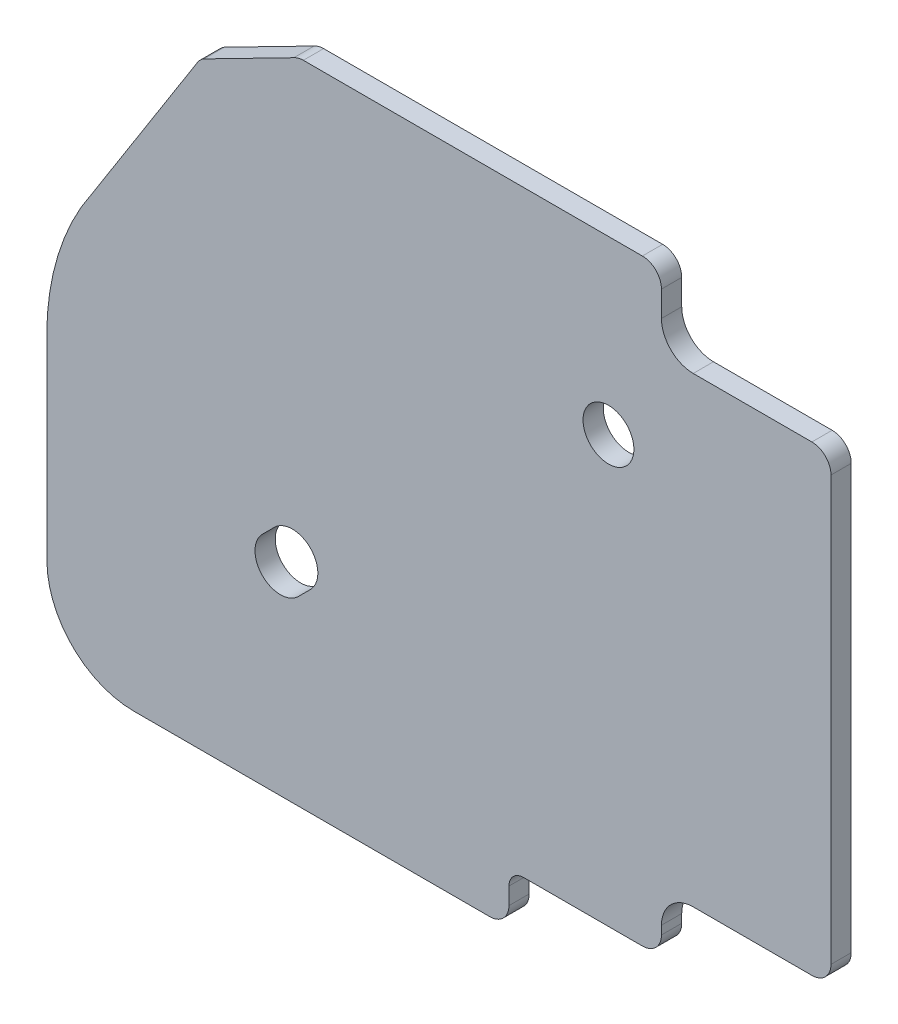
ISO-10303-21;
HEADER;
FILE_DESCRIPTION(('STEP AP214'),'2;1');
FILE_NAME('part.step','',(''),(''),'','','');
FILE_SCHEMA(('AUTOMOTIVE_DESIGN { 1 0 10303 214 1 1 1 1 }'));
ENDSEC;
DATA;
#1=APPLICATION_CONTEXT('core data for automotive mechanical design processes');
#2=APPLICATION_PROTOCOL_DEFINITION('international standard','automotive_design',2000,#1);
#3=PRODUCT_CONTEXT('',#1,'mechanical');
#4=PRODUCT('Part','Part','',(#3));
#5=PRODUCT_RELATED_PRODUCT_CATEGORY('part','',(#4));
#6=PRODUCT_DEFINITION_FORMATION('','',#4);
#7=PRODUCT_DEFINITION_CONTEXT('part definition',#1,'design');
#8=PRODUCT_DEFINITION('design','',#6,#7);
#9=PRODUCT_DEFINITION_SHAPE('','',#8);
#10=(LENGTH_UNIT() NAMED_UNIT(*) SI_UNIT(.MILLI.,.METRE.));
#11=(NAMED_UNIT(*) PLANE_ANGLE_UNIT() SI_UNIT($,.RADIAN.));
#12=(NAMED_UNIT(*) SI_UNIT($,.STERADIAN.) SOLID_ANGLE_UNIT());
#13=UNCERTAINTY_MEASURE_WITH_UNIT(LENGTH_MEASURE(1.E-05),#10,'distance_accuracy_value','');
#14=(GEOMETRIC_REPRESENTATION_CONTEXT(3) GLOBAL_UNCERTAINTY_ASSIGNED_CONTEXT((#13)) GLOBAL_UNIT_ASSIGNED_CONTEXT((#10,
#11,#12)) REPRESENTATION_CONTEXT('',''));
#15=CARTESIAN_POINT('',(0.,0.,0.));
#16=DIRECTION('',(0.,0.,1.));
#17=DIRECTION('',(1.,0.,0.));
#18=AXIS2_PLACEMENT_3D('',#15,#16,#17);
#19=CARTESIAN_POINT('',(4.999,-0.127,0.));
#20=DIRECTION('',(0.,1.,0.));
#21=DIRECTION('',(1.,0.,0.));
#22=AXIS2_PLACEMENT_3D('',#19,#20,#21);
#23=PLANE('',#22);
#24=DIRECTION('',(1.,0.,0.));
#25=VECTOR('',#24,1.);
#26=CARTESIAN_POINT('',(4.999,-0.127,1.19540274));
#27=LINE('',#26,#25);
#28=CARTESIAN_POINT('',(4.999,-0.127,1.19540274));
#29=VERTEX_POINT('',#28);
#30=CARTESIAN_POINT('',(26.,-0.127,1.19540274));
#31=VERTEX_POINT('',#30);
#32=EDGE_CURVE('E11',#29,#31,#27,.T.);
#33=ORIENTED_EDGE('',*,*,#32,.F.);
#34=DIRECTION('',(0.,0.,1.));
#35=VECTOR('',#34,1.);
#36=CARTESIAN_POINT('',(4.999,-0.127,0.));
#37=LINE('',#36,#35);
#38=CARTESIAN_POINT('',(4.999,-0.127,0.));
#39=VERTEX_POINT('',#38);
#40=EDGE_CURVE('E24',#39,#29,#37,.T.);
#41=ORIENTED_EDGE('',*,*,#40,.F.);
#42=DIRECTION('',(1.,0.,0.));
#43=VECTOR('',#42,1.);
#44=CARTESIAN_POINT('',(4.999,-0.127,0.));
#45=LINE('',#44,#43);
#46=CARTESIAN_POINT('',(26.,-0.127,0.));
#47=VERTEX_POINT('',#46);
#48=EDGE_CURVE('E446',#39,#47,#45,.T.);
#49=ORIENTED_EDGE('',*,*,#48,.T.);
#50=DIRECTION('',(0.,0.,1.));
#51=VECTOR('',#50,1.);
#52=CARTESIAN_POINT('',(26.,-0.127,0.));
#53=LINE('',#52,#51);
#54=EDGE_CURVE('E37',#47,#31,#53,.T.);
#55=ORIENTED_EDGE('',*,*,#54,.T.);
#56=EDGE_LOOP('',(#33,#41,#49,#55));
#57=FACE_BOUND('',#56,.T.);
#58=ADVANCED_FACE('F17',(#57),#23,.F.);
#59=CARTESIAN_POINT('',(26.000309421842,0.999690578158457,0.));
#60=DIRECTION('',(0.,0.,-1.));
#61=DIRECTION('',(-0.000274628931733841,-0.999999962289474,0.));
#62=AXIS2_PLACEMENT_3D('',#59,#60,#61);
#63=CYLINDRICAL_SURFACE('',#62,1.126690620647);
#64=CARTESIAN_POINT('',(26.000309421842,0.999690578158457,1.19540274));
#65=DIRECTION('',(0.,0.,1.));
#66=DIRECTION('',(-0.000274628931733841,-0.999999962289474,0.));
#67=AXIS2_PLACEMENT_3D('',#64,#65,#66);
#68=CIRCLE('',#67,1.126690620647);
#69=CARTESIAN_POINT('',(27.127,1.,1.19540274));
#70=VERTEX_POINT('',#69);
#71=EDGE_CURVE('E442',#31,#70,#68,.T.);
#72=ORIENTED_EDGE('',*,*,#71,.F.);
#73=ORIENTED_EDGE('',*,*,#54,.F.);
#74=CARTESIAN_POINT('',(26.000309421842,0.999690578158457,0.));
#75=DIRECTION('',(0.,0.,1.));
#76=DIRECTION('',(-0.000274628931733841,-0.999999962289474,0.));
#77=AXIS2_PLACEMENT_3D('',#74,#75,#76);
#78=CIRCLE('',#77,1.126690620647);
#79=CARTESIAN_POINT('',(27.127,1.,0.));
#80=VERTEX_POINT('',#79);
#81=EDGE_CURVE('E439',#47,#80,#78,.T.);
#82=ORIENTED_EDGE('',*,*,#81,.T.);
#83=DIRECTION('',(0.,0.,1.));
#84=VECTOR('',#83,1.);
#85=CARTESIAN_POINT('',(27.127,1.,0.));
#86=LINE('',#85,#84);
#87=EDGE_CURVE('E437',#80,#70,#86,.T.);
#88=ORIENTED_EDGE('',*,*,#87,.T.);
#89=EDGE_LOOP('',(#72,#73,#82,#88));
#90=FACE_BOUND('',#89,.T.);
#91=ADVANCED_FACE('F456',(#90),#63,.T.);
#92=CARTESIAN_POINT('',(27.127,1.,0.));
#93=DIRECTION('',(-1.,0.,0.));
#94=DIRECTION('',(0.,1.,0.));
#95=AXIS2_PLACEMENT_3D('',#92,#93,#94);
#96=PLANE('',#95);
#97=DIRECTION('',(0.,1.,0.));
#98=VECTOR('',#97,1.);
#99=CARTESIAN_POINT('',(27.127,1.,1.19540274));
#100=LINE('',#99,#98);
#101=CARTESIAN_POINT('',(27.127,2.,1.19540274));
#102=VERTEX_POINT('',#101);
#103=EDGE_CURVE('E434',#70,#102,#100,.T.);
#104=ORIENTED_EDGE('',*,*,#103,.F.);
#105=ORIENTED_EDGE('',*,*,#87,.F.);
#106=DIRECTION('',(0.,1.,0.));
#107=VECTOR('',#106,1.);
#108=CARTESIAN_POINT('',(27.127,1.,0.));
#109=LINE('',#108,#107);
#110=CARTESIAN_POINT('',(27.127,2.,0.));
#111=VERTEX_POINT('',#110);
#112=EDGE_CURVE('E431',#80,#111,#109,.T.);
#113=ORIENTED_EDGE('',*,*,#112,.T.);
#114=DIRECTION('',(0.,0.,1.));
#115=VECTOR('',#114,1.);
#116=CARTESIAN_POINT('',(27.127,2.,0.));
#117=LINE('',#116,#115);
#118=EDGE_CURVE('E429',#111,#102,#117,.T.);
#119=ORIENTED_EDGE('',*,*,#118,.T.);
#120=EDGE_LOOP('',(#104,#105,#113,#119));
#121=FACE_BOUND('',#120,.T.);
#122=ADVANCED_FACE('F463',(#121),#96,.F.);
#123=CARTESIAN_POINT('',(28.001040166205,1.998959833795,0.));
#124=DIRECTION('',(0.,0.,-1.));
#125=DIRECTION('',(-0.999999291871229,0.00119006598167,0.));
#126=AXIS2_PLACEMENT_3D('',#123,#124,#125);
#127=CYLINDRICAL_SURFACE('',#126,0.874040785138412);
#128=CARTESIAN_POINT('',(28.001040166205,1.998959833795,1.19540274));
#129=DIRECTION('',(0.,0.,-1.));
#130=DIRECTION('',(-0.999999291871229,0.00119006598167,0.));
#131=AXIS2_PLACEMENT_3D('',#128,#129,#130);
#132=CIRCLE('',#131,0.874040785138412);
#133=CARTESIAN_POINT('',(28.,2.873,1.19540274));
#134=VERTEX_POINT('',#133);
#135=EDGE_CURVE('E426',#102,#134,#132,.T.);
#136=ORIENTED_EDGE('',*,*,#135,.F.);
#137=ORIENTED_EDGE('',*,*,#118,.F.);
#138=CARTESIAN_POINT('',(28.001040166205,1.998959833795,0.));
#139=DIRECTION('',(0.,0.,-1.));
#140=DIRECTION('',(-0.999999291871229,0.00119006598167,0.));
#141=AXIS2_PLACEMENT_3D('',#138,#139,#140);
#142=CIRCLE('',#141,0.874040785138412);
#143=CARTESIAN_POINT('',(28.,2.873,0.));
#144=VERTEX_POINT('',#143);
#145=EDGE_CURVE('E423',#111,#144,#142,.T.);
#146=ORIENTED_EDGE('',*,*,#145,.T.);
#147=DIRECTION('',(0.,0.,1.));
#148=VECTOR('',#147,1.);
#149=CARTESIAN_POINT('',(28.,2.873,0.));
#150=LINE('',#149,#148);
#151=EDGE_CURVE('E421',#144,#134,#150,.T.);
#152=ORIENTED_EDGE('',*,*,#151,.T.);
#153=EDGE_LOOP('',(#136,#137,#146,#152));
#154=FACE_BOUND('',#153,.T.);
#155=ADVANCED_FACE('F465',(#154),#127,.F.);
#156=CARTESIAN_POINT('',(28.,2.873,0.));
#157=DIRECTION('',(0.,1.,0.));
#158=DIRECTION('',(1.,0.,0.));
#159=AXIS2_PLACEMENT_3D('',#156,#157,#158);
#160=PLANE('',#159);
#161=DIRECTION('',(1.,0.,0.));
#162=VECTOR('',#161,1.);
#163=CARTESIAN_POINT('',(28.,2.873,1.19540274));
#164=LINE('',#163,#162);
#165=CARTESIAN_POINT('',(35.,2.873,1.19540274));
#166=VERTEX_POINT('',#165);
#167=EDGE_CURVE('E418',#134,#166,#164,.T.);
#168=ORIENTED_EDGE('',*,*,#167,.F.);
#169=ORIENTED_EDGE('',*,*,#151,.F.);
#170=DIRECTION('',(1.,0.,0.));
#171=VECTOR('',#170,1.);
#172=CARTESIAN_POINT('',(28.,2.873,0.));
#173=LINE('',#172,#171);
#174=CARTESIAN_POINT('',(35.,2.873,0.));
#175=VERTEX_POINT('',#174);
#176=EDGE_CURVE('E415',#144,#175,#173,.T.);
#177=ORIENTED_EDGE('',*,*,#176,.T.);
#178=DIRECTION('',(0.,0.,1.));
#179=VECTOR('',#178,1.);
#180=CARTESIAN_POINT('',(35.,2.873,0.));
#181=LINE('',#180,#179);
#182=EDGE_CURVE('E413',#175,#166,#181,.T.);
#183=ORIENTED_EDGE('',*,*,#182,.T.);
#184=EDGE_LOOP('',(#168,#169,#177,#183));
#185=FACE_BOUND('',#184,.T.);
#186=ADVANCED_FACE('F470',(#185),#160,.F.);
#187=CARTESIAN_POINT('',(35.000309421842,3.999690578158,0.));
#188=DIRECTION('',(0.,0.,-1.));
#189=DIRECTION('',(-0.000274628931727531,-0.999999962289474,0.));
#190=AXIS2_PLACEMENT_3D('',#187,#188,#189);
#191=CYLINDRICAL_SURFACE('',#190,1.126690620647);
#192=CARTESIAN_POINT('',(35.000309421842,3.999690578158,1.19540274));
#193=DIRECTION('',(0.,0.,1.));
#194=DIRECTION('',(-0.000274628931727531,-0.999999962289474,0.));
#195=AXIS2_PLACEMENT_3D('',#192,#193,#194);
#196=CIRCLE('',#195,1.126690620647);
#197=CARTESIAN_POINT('',(36.127,4.,1.19540274));
#198=VERTEX_POINT('',#197);
#199=EDGE_CURVE('E410',#166,#198,#196,.T.);
#200=ORIENTED_EDGE('',*,*,#199,.F.);
#201=ORIENTED_EDGE('',*,*,#182,.F.);
#202=CARTESIAN_POINT('',(35.000309421842,3.999690578158,0.));
#203=DIRECTION('',(0.,0.,1.));
#204=DIRECTION('',(-0.000274628931727531,-0.999999962289474,0.));
#205=AXIS2_PLACEMENT_3D('',#202,#203,#204);
#206=CIRCLE('',#205,1.126690620647);
#207=CARTESIAN_POINT('',(36.127,4.,0.));
#208=VERTEX_POINT('',#207);
#209=EDGE_CURVE('E407',#175,#208,#206,.T.);
#210=ORIENTED_EDGE('',*,*,#209,.T.);
#211=DIRECTION('',(0.,0.,1.));
#212=VECTOR('',#211,1.);
#213=CARTESIAN_POINT('',(36.127,4.,0.));
#214=LINE('',#213,#212);
#215=EDGE_CURVE('E405',#208,#198,#214,.T.);
#216=ORIENTED_EDGE('',*,*,#215,.T.);
#217=EDGE_LOOP('',(#200,#201,#210,#216));
#218=FACE_BOUND('',#217,.T.);
#219=ADVANCED_FACE('F473',(#218),#191,.T.);
#220=CARTESIAN_POINT('',(36.127,4.,0.));
#221=DIRECTION('',(-1.,0.,0.));
#222=DIRECTION('',(0.,1.,0.));
#223=AXIS2_PLACEMENT_3D('',#220,#221,#222);
#224=PLANE('',#223);
#225=DIRECTION('',(0.,1.,0.));
#226=VECTOR('',#225,1.);
#227=CARTESIAN_POINT('',(36.127,4.,1.19540274));
#228=LINE('',#227,#226);
#229=CARTESIAN_POINT('',(36.127,4.5,1.19540274));
#230=VERTEX_POINT('',#229);
#231=EDGE_CURVE('E402',#198,#230,#228,.T.);
#232=ORIENTED_EDGE('',*,*,#231,.F.);
#233=ORIENTED_EDGE('',*,*,#215,.F.);
#234=DIRECTION('',(0.,1.,0.));
#235=VECTOR('',#234,1.);
#236=CARTESIAN_POINT('',(36.127,4.,0.));
#237=LINE('',#236,#235);
#238=CARTESIAN_POINT('',(36.127,4.5,0.));
#239=VERTEX_POINT('',#238);
#240=EDGE_CURVE('E399',#208,#239,#237,.T.);
#241=ORIENTED_EDGE('',*,*,#240,.T.);
#242=DIRECTION('',(0.,0.,1.));
#243=VECTOR('',#242,1.);
#244=CARTESIAN_POINT('',(36.127,4.5,0.));
#245=LINE('',#244,#243);
#246=EDGE_CURVE('E397',#239,#230,#245,.T.);
#247=ORIENTED_EDGE('',*,*,#246,.T.);
#248=EDGE_LOOP('',(#232,#233,#241,#247));
#249=FACE_BOUND('',#248,.T.);
#250=ADVANCED_FACE('F478',(#249),#224,.F.);
#251=CARTESIAN_POINT('',(38.001404516129,4.498595483871,0.));
#252=DIRECTION('',(0.,0.,-1.));
#253=DIRECTION('',(-0.999999719264949,0.00074931303390015,0.));
#254=AXIS2_PLACEMENT_3D('',#251,#252,#253);
#255=CYLINDRICAL_SURFACE('',#254,1.87440504234);
#256=CARTESIAN_POINT('',(38.001404516129,4.498595483871,1.19540274));
#257=DIRECTION('',(0.,0.,-1.));
#258=DIRECTION('',(-0.999999719264949,0.00074931303390015,0.));
#259=AXIS2_PLACEMENT_3D('',#256,#257,#258);
#260=CIRCLE('',#259,1.87440504234);
#261=CARTESIAN_POINT('',(38.,6.373,1.19540274));
#262=VERTEX_POINT('',#261);
#263=EDGE_CURVE('E394',#230,#262,#260,.T.);
#264=ORIENTED_EDGE('',*,*,#263,.F.);
#265=ORIENTED_EDGE('',*,*,#246,.F.);
#266=CARTESIAN_POINT('',(38.001404516129,4.498595483871,0.));
#267=DIRECTION('',(0.,0.,-1.));
#268=DIRECTION('',(-0.999999719264949,0.00074931303390015,0.));
#269=AXIS2_PLACEMENT_3D('',#266,#267,#268);
#270=CIRCLE('',#269,1.87440504234);
#271=CARTESIAN_POINT('',(38.,6.373,0.));
#272=VERTEX_POINT('',#271);
#273=EDGE_CURVE('E391',#239,#272,#270,.T.);
#274=ORIENTED_EDGE('',*,*,#273,.T.);
#275=DIRECTION('',(0.,0.,1.));
#276=VECTOR('',#275,1.);
#277=CARTESIAN_POINT('',(38.,6.373,0.));
#278=LINE('',#277,#276);
#279=EDGE_CURVE('E389',#272,#262,#278,.T.);
#280=ORIENTED_EDGE('',*,*,#279,.T.);
#281=EDGE_LOOP('',(#264,#265,#274,#280));
#282=FACE_BOUND('',#281,.T.);
#283=ADVANCED_FACE('F481',(#282),#255,.F.);
#284=CARTESIAN_POINT('',(38.,6.373,0.));
#285=DIRECTION('',(0.,1.,0.));
#286=DIRECTION('',(1.,0.,0.));
#287=AXIS2_PLACEMENT_3D('',#284,#285,#286);
#288=PLANE('',#287);
#289=DIRECTION('',(1.,0.,0.));
#290=VECTOR('',#289,1.);
#291=CARTESIAN_POINT('',(38.,6.373,1.19540274));
#292=LINE('',#291,#290);
#293=CARTESIAN_POINT('',(45.,6.373,1.19540274));
#294=VERTEX_POINT('',#293);
#295=EDGE_CURVE('E386',#262,#294,#292,.T.);
#296=ORIENTED_EDGE('',*,*,#295,.F.);
#297=ORIENTED_EDGE('',*,*,#279,.F.);
#298=DIRECTION('',(1.,0.,0.));
#299=VECTOR('',#298,1.);
#300=CARTESIAN_POINT('',(38.,6.373,0.));
#301=LINE('',#300,#299);
#302=CARTESIAN_POINT('',(45.,6.373,0.));
#303=VERTEX_POINT('',#302);
#304=EDGE_CURVE('E383',#272,#303,#301,.T.);
#305=ORIENTED_EDGE('',*,*,#304,.T.);
#306=DIRECTION('',(0.,0.,1.));
#307=VECTOR('',#306,1.);
#308=CARTESIAN_POINT('',(45.,6.373,0.));
#309=LINE('',#308,#307);
#310=EDGE_CURVE('E381',#303,#294,#309,.T.);
#311=ORIENTED_EDGE('',*,*,#310,.T.);
#312=EDGE_LOOP('',(#296,#297,#305,#311));
#313=FACE_BOUND('',#312,.T.);
#314=ADVANCED_FACE('F486',(#313),#288,.F.);
#315=CARTESIAN_POINT('',(45.000309421842,7.499690578158,0.));
#316=DIRECTION('',(0.,0.,-1.));
#317=DIRECTION('',(-0.000274628931727531,-0.999999962289474,0.));
#318=AXIS2_PLACEMENT_3D('',#315,#316,#317);
#319=CYLINDRICAL_SURFACE('',#318,1.126690620647);
#320=CARTESIAN_POINT('',(45.000309421842,7.499690578158,1.19540274));
#321=DIRECTION('',(0.,0.,1.));
#322=DIRECTION('',(-0.000274628931727531,-0.999999962289474,0.));
#323=AXIS2_PLACEMENT_3D('',#320,#321,#322);
#324=CIRCLE('',#323,1.126690620647);
#325=CARTESIAN_POINT('',(46.127,7.5,1.19540274));
#326=VERTEX_POINT('',#325);
#327=EDGE_CURVE('E378',#294,#326,#324,.T.);
#328=ORIENTED_EDGE('',*,*,#327,.F.);
#329=ORIENTED_EDGE('',*,*,#310,.F.);
#330=CARTESIAN_POINT('',(45.000309421842,7.499690578158,0.));
#331=DIRECTION('',(0.,0.,1.));
#332=DIRECTION('',(-0.000274628931727531,-0.999999962289474,0.));
#333=AXIS2_PLACEMENT_3D('',#330,#331,#332);
#334=CIRCLE('',#333,1.126690620647);
#335=CARTESIAN_POINT('',(46.127,7.5,0.));
#336=VERTEX_POINT('',#335);
#337=EDGE_CURVE('E375',#303,#336,#334,.T.);
#338=ORIENTED_EDGE('',*,*,#337,.T.);
#339=DIRECTION('',(0.,0.,1.));
#340=VECTOR('',#339,1.);
#341=CARTESIAN_POINT('',(46.127,7.5,0.));
#342=LINE('',#341,#340);
#343=EDGE_CURVE('E373',#336,#326,#342,.T.);
#344=ORIENTED_EDGE('',*,*,#343,.T.);
#345=EDGE_LOOP('',(#328,#329,#338,#344));
#346=FACE_BOUND('',#345,.T.);
#347=ADVANCED_FACE('F489',(#346),#319,.T.);
#348=CARTESIAN_POINT('',(46.127,7.5,0.));
#349=DIRECTION('',(-1.,0.,0.));
#350=DIRECTION('',(0.,1.,0.));
#351=AXIS2_PLACEMENT_3D('',#348,#349,#350);
#352=PLANE('',#351);
#353=DIRECTION('',(0.,1.,0.));
#354=VECTOR('',#353,1.);
#355=CARTESIAN_POINT('',(46.127,7.5,1.19540274));
#356=LINE('',#355,#354);
#357=CARTESIAN_POINT('',(46.127,32.5,1.19540274));
#358=VERTEX_POINT('',#357);
#359=EDGE_CURVE('E370',#326,#358,#356,.T.);
#360=ORIENTED_EDGE('',*,*,#359,.F.);
#361=ORIENTED_EDGE('',*,*,#343,.F.);
#362=DIRECTION('',(0.,1.,0.));
#363=VECTOR('',#362,1.);
#364=CARTESIAN_POINT('',(46.127,7.5,0.));
#365=LINE('',#364,#363);
#366=CARTESIAN_POINT('',(46.127,32.5,0.));
#367=VERTEX_POINT('',#366);
#368=EDGE_CURVE('E367',#336,#367,#365,.T.);
#369=ORIENTED_EDGE('',*,*,#368,.T.);
#370=DIRECTION('',(0.,0.,1.));
#371=VECTOR('',#370,1.);
#372=CARTESIAN_POINT('',(46.127,32.5,0.));
#373=LINE('',#372,#371);
#374=EDGE_CURVE('E365',#367,#358,#373,.T.);
#375=ORIENTED_EDGE('',*,*,#374,.T.);
#376=EDGE_LOOP('',(#360,#361,#369,#375));
#377=FACE_BOUND('',#376,.T.);
#378=ADVANCED_FACE('F494',(#377),#352,.F.);
#379=CARTESIAN_POINT('',(45.000309421842,32.500309421842,0.));
#380=DIRECTION('',(0.,0.,-1.));
#381=DIRECTION('',(0.999999962289474,-0.000274628931714915,0.));
#382=AXIS2_PLACEMENT_3D('',#379,#380,#381);
#383=CYLINDRICAL_SURFACE('',#382,1.126690620647);
#384=CARTESIAN_POINT('',(45.000309421842,32.500309421842,1.19540274));
#385=DIRECTION('',(0.,0.,1.));
#386=DIRECTION('',(0.999999962289474,-0.000274628931714915,0.));
#387=AXIS2_PLACEMENT_3D('',#384,#385,#386);
#388=CIRCLE('',#387,1.126690620647);
#389=CARTESIAN_POINT('',(45.,33.627,1.19540274));
#390=VERTEX_POINT('',#389);
#391=EDGE_CURVE('E362',#358,#390,#388,.T.);
#392=ORIENTED_EDGE('',*,*,#391,.F.);
#393=ORIENTED_EDGE('',*,*,#374,.F.);
#394=CARTESIAN_POINT('',(45.000309421842,32.500309421842,0.));
#395=DIRECTION('',(0.,0.,1.));
#396=DIRECTION('',(0.999999962289474,-0.000274628931714915,0.));
#397=AXIS2_PLACEMENT_3D('',#394,#395,#396);
#398=CIRCLE('',#397,1.126690620647);
#399=CARTESIAN_POINT('',(45.,33.627,0.));
#400=VERTEX_POINT('',#399);
#401=EDGE_CURVE('E359',#367,#400,#398,.T.);
#402=ORIENTED_EDGE('',*,*,#401,.T.);
#403=DIRECTION('',(0.,0.,1.));
#404=VECTOR('',#403,1.);
#405=CARTESIAN_POINT('',(45.,33.627,0.));
#406=LINE('',#405,#404);
#407=EDGE_CURVE('E357',#400,#390,#406,.T.);
#408=ORIENTED_EDGE('',*,*,#407,.T.);
#409=EDGE_LOOP('',(#392,#393,#402,#408));
#410=FACE_BOUND('',#409,.T.);
#411=ADVANCED_FACE('F497',(#410),#383,.T.);
#412=CARTESIAN_POINT('',(45.,33.627,0.));
#413=DIRECTION('',(0.,-1.,0.));
#414=DIRECTION('',(-1.,0.,0.));
#415=AXIS2_PLACEMENT_3D('',#412,#413,#414);
#416=PLANE('',#415);
#417=DIRECTION('',(-1.,0.,0.));
#418=VECTOR('',#417,1.);
#419=CARTESIAN_POINT('',(45.,33.627,1.19540274));
#420=LINE('',#419,#418);
#421=CARTESIAN_POINT('',(38.,33.627,1.19540274));
#422=VERTEX_POINT('',#421);
#423=EDGE_CURVE('E354',#390,#422,#420,.T.);
#424=ORIENTED_EDGE('',*,*,#423,.F.);
#425=ORIENTED_EDGE('',*,*,#407,.F.);
#426=DIRECTION('',(-1.,0.,0.));
#427=VECTOR('',#426,1.);
#428=CARTESIAN_POINT('',(45.,33.627,0.));
#429=LINE('',#428,#427);
#430=CARTESIAN_POINT('',(38.,33.627,0.));
#431=VERTEX_POINT('',#430);
#432=EDGE_CURVE('E351',#400,#431,#429,.T.);
#433=ORIENTED_EDGE('',*,*,#432,.T.);
#434=DIRECTION('',(0.,0.,1.));
#435=VECTOR('',#434,1.);
#436=CARTESIAN_POINT('',(38.,33.627,0.));
#437=LINE('',#436,#435);
#438=EDGE_CURVE('E349',#431,#422,#437,.T.);
#439=ORIENTED_EDGE('',*,*,#438,.T.);
#440=EDGE_LOOP('',(#424,#425,#433,#439));
#441=FACE_BOUND('',#440,.T.);
#442=ADVANCED_FACE('F502',(#441),#416,.F.);
#443=CARTESIAN_POINT('',(38.001404516129,35.501404516129,0.));
#444=DIRECTION('',(0.,0.,-1.));
#445=DIRECTION('',(-0.000749313033901098,-0.999999719264949,0.));
#446=AXIS2_PLACEMENT_3D('',#443,#444,#445);
#447=CYLINDRICAL_SURFACE('',#446,1.87440504234);
#448=CARTESIAN_POINT('',(38.001404516129,35.501404516129,1.19540274));
#449=DIRECTION('',(0.,0.,-1.));
#450=DIRECTION('',(-0.000749313033901098,-0.999999719264949,0.));
#451=AXIS2_PLACEMENT_3D('',#448,#449,#450);
#452=CIRCLE('',#451,1.87440504234);
#453=CARTESIAN_POINT('',(36.127,35.5,1.19540274));
#454=VERTEX_POINT('',#453);
#455=EDGE_CURVE('E346',#422,#454,#452,.T.);
#456=ORIENTED_EDGE('',*,*,#455,.F.);
#457=ORIENTED_EDGE('',*,*,#438,.F.);
#458=CARTESIAN_POINT('',(38.001404516129,35.501404516129,0.));
#459=DIRECTION('',(0.,0.,-1.));
#460=DIRECTION('',(-0.000749313033901098,-0.999999719264949,0.));
#461=AXIS2_PLACEMENT_3D('',#458,#459,#460);
#462=CIRCLE('',#461,1.87440504234);
#463=CARTESIAN_POINT('',(36.127,35.5,0.));
#464=VERTEX_POINT('',#463);
#465=EDGE_CURVE('E343',#431,#464,#462,.T.);
#466=ORIENTED_EDGE('',*,*,#465,.T.);
#467=DIRECTION('',(0.,0.,1.));
#468=VECTOR('',#467,1.);
#469=CARTESIAN_POINT('',(36.127,35.5,0.));
#470=LINE('',#469,#468);
#471=EDGE_CURVE('E341',#464,#454,#470,.T.);
#472=ORIENTED_EDGE('',*,*,#471,.T.);
#473=EDGE_LOOP('',(#456,#457,#466,#472));
#474=FACE_BOUND('',#473,.T.);
#475=ADVANCED_FACE('F505',(#474),#447,.F.);
#476=CARTESIAN_POINT('',(36.127,35.5,0.));
#477=DIRECTION('',(-1.,0.,0.));
#478=DIRECTION('',(0.,1.,0.));
#479=AXIS2_PLACEMENT_3D('',#476,#477,#478);
#480=PLANE('',#479);
#481=DIRECTION('',(0.,1.,0.));
#482=VECTOR('',#481,1.);
#483=CARTESIAN_POINT('',(36.127,35.5,1.19540274));
#484=LINE('',#483,#482);
#485=CARTESIAN_POINT('',(36.127,37.,1.19540274));
#486=VERTEX_POINT('',#485);
#487=EDGE_CURVE('E338',#454,#486,#484,.T.);
#488=ORIENTED_EDGE('',*,*,#487,.F.);
#489=ORIENTED_EDGE('',*,*,#471,.F.);
#490=DIRECTION('',(0.,1.,0.));
#491=VECTOR('',#490,1.);
#492=CARTESIAN_POINT('',(36.127,35.5,0.));
#493=LINE('',#492,#491);
#494=CARTESIAN_POINT('',(36.127,37.,0.));
#495=VERTEX_POINT('',#494);
#496=EDGE_CURVE('E335',#464,#495,#493,.T.);
#497=ORIENTED_EDGE('',*,*,#496,.T.);
#498=DIRECTION('',(0.,0.,1.));
#499=VECTOR('',#498,1.);
#500=CARTESIAN_POINT('',(36.127,37.,0.));
#501=LINE('',#500,#499);
#502=EDGE_CURVE('E333',#495,#486,#501,.T.);
#503=ORIENTED_EDGE('',*,*,#502,.T.);
#504=EDGE_LOOP('',(#488,#489,#497,#503));
#505=FACE_BOUND('',#504,.T.);
#506=ADVANCED_FACE('F510',(#505),#480,.F.);
#507=CARTESIAN_POINT('',(35.000309421842,37.000309421842,0.));
#508=DIRECTION('',(0.,0.,-1.));
#509=DIRECTION('',(0.999999962289474,-0.000274628931714915,0.));
#510=AXIS2_PLACEMENT_3D('',#507,#508,#509);
#511=CYLINDRICAL_SURFACE('',#510,1.126690620647);
#512=CARTESIAN_POINT('',(35.000309421842,37.000309421842,1.19540274));
#513=DIRECTION('',(0.,0.,1.));
#514=DIRECTION('',(0.999999962289474,-0.000274628931714915,0.));
#515=AXIS2_PLACEMENT_3D('',#512,#513,#514);
#516=CIRCLE('',#515,1.126690620647);
#517=CARTESIAN_POINT('',(35.,38.127,1.19540274));
#518=VERTEX_POINT('',#517);
#519=EDGE_CURVE('E330',#486,#518,#516,.T.);
#520=ORIENTED_EDGE('',*,*,#519,.F.);
#521=ORIENTED_EDGE('',*,*,#502,.F.);
#522=CARTESIAN_POINT('',(35.000309421842,37.000309421842,0.));
#523=DIRECTION('',(0.,0.,1.));
#524=DIRECTION('',(0.999999962289474,-0.000274628931714915,0.));
#525=AXIS2_PLACEMENT_3D('',#522,#523,#524);
#526=CIRCLE('',#525,1.126690620647);
#527=CARTESIAN_POINT('',(35.,38.127,0.));
#528=VERTEX_POINT('',#527);
#529=EDGE_CURVE('E327',#495,#528,#526,.T.);
#530=ORIENTED_EDGE('',*,*,#529,.T.);
#531=DIRECTION('',(0.,0.,1.));
#532=VECTOR('',#531,1.);
#533=CARTESIAN_POINT('',(35.,38.127,0.));
#534=LINE('',#533,#532);
#535=EDGE_CURVE('E325',#528,#518,#534,.T.);
#536=ORIENTED_EDGE('',*,*,#535,.T.);
#537=EDGE_LOOP('',(#520,#521,#530,#536));
#538=FACE_BOUND('',#537,.T.);
#539=ADVANCED_FACE('F513',(#538),#511,.T.);
#540=CARTESIAN_POINT('',(35.,38.127,0.));
#541=DIRECTION('',(0.,-1.,0.));
#542=DIRECTION('',(-1.,0.,0.));
#543=AXIS2_PLACEMENT_3D('',#540,#541,#542);
#544=PLANE('',#543);
#545=DIRECTION('',(-1.,0.,0.));
#546=VECTOR('',#545,1.);
#547=CARTESIAN_POINT('',(35.,38.127,1.19540274));
#548=LINE('',#547,#546);
#549=CARTESIAN_POINT('',(15.,38.127,1.19540274));
#550=VERTEX_POINT('',#549);
#551=EDGE_CURVE('E322',#518,#550,#548,.T.);
#552=ORIENTED_EDGE('',*,*,#551,.F.);
#553=ORIENTED_EDGE('',*,*,#535,.F.);
#554=DIRECTION('',(-1.,0.,0.));
#555=VECTOR('',#554,1.);
#556=CARTESIAN_POINT('',(35.,38.127,0.));
#557=LINE('',#556,#555);
#558=CARTESIAN_POINT('',(15.,38.127,0.));
#559=VERTEX_POINT('',#558);
#560=EDGE_CURVE('E319',#528,#559,#557,.T.);
#561=ORIENTED_EDGE('',*,*,#560,.T.);
#562=DIRECTION('',(0.,0.,1.));
#563=VECTOR('',#562,1.);
#564=CARTESIAN_POINT('',(15.,38.127,0.));
#565=LINE('',#564,#563);
#566=EDGE_CURVE('E317',#559,#550,#565,.T.);
#567=ORIENTED_EDGE('',*,*,#566,.T.);
#568=EDGE_LOOP('',(#552,#553,#561,#567));
#569=FACE_BOUND('',#568,.T.);
#570=ADVANCED_FACE('F518',(#569),#544,.F.);
#571=CARTESIAN_POINT('',(15.001301388635,36.991489402521,0.));
#572=DIRECTION('',(0.,0.,-1.));
#573=DIRECTION('',(-0.001146081580698,0.99999934324829,0.));
#574=AXIS2_PLACEMENT_3D('',#571,#572,#573);
#575=CYLINDRICAL_SURFACE('',#574,1.135511343228);
#576=CARTESIAN_POINT('',(15.001301388635,36.991489402521,1.19540274));
#577=DIRECTION('',(0.,0.,1.));
#578=DIRECTION('',(-0.001146081580698,0.99999934324829,0.));
#579=AXIS2_PLACEMENT_3D('',#576,#577,#578);
#580=CIRCLE('',#579,1.135511343228);
#581=CARTESIAN_POINT('',(14.439,37.978,1.19540274));
#582=VERTEX_POINT('',#581);
#583=EDGE_CURVE('E314',#550,#582,#580,.T.);
#584=ORIENTED_EDGE('',*,*,#583,.F.);
#585=ORIENTED_EDGE('',*,*,#566,.F.);
#586=CARTESIAN_POINT('',(15.001301388635,36.991489402521,0.));
#587=DIRECTION('',(0.,0.,1.));
#588=DIRECTION('',(-0.001146081580698,0.99999934324829,0.));
#589=AXIS2_PLACEMENT_3D('',#586,#587,#588);
#590=CIRCLE('',#589,1.135511343228);
#591=CARTESIAN_POINT('',(14.439,37.978,0.));
#592=VERTEX_POINT('',#591);
#593=EDGE_CURVE('E311',#559,#592,#590,.T.);
#594=ORIENTED_EDGE('',*,*,#593,.T.);
#595=DIRECTION('',(0.,0.,1.));
#596=VECTOR('',#595,1.);
#597=CARTESIAN_POINT('',(14.439,37.978,0.));
#598=LINE('',#597,#596);
#599=EDGE_CURVE('E309',#592,#582,#598,.T.);
#600=ORIENTED_EDGE('',*,*,#599,.T.);
#601=EDGE_LOOP('',(#584,#585,#594,#600));
#602=FACE_BOUND('',#601,.T.);
#603=ADVANCED_FACE('F521',(#602),#575,.T.);
#604=CARTESIAN_POINT('',(14.439,37.978,0.));
#605=DIRECTION('',(0.455398342826436,-0.890287790184127,0.));
#606=DIRECTION('',(-0.890287790184127,-0.455398342826436,0.));
#607=AXIS2_PLACEMENT_3D('',#604,#605,#606);
#608=PLANE('',#607);
#609=DIRECTION('',(-0.890287790184127,-0.455398342826436,0.));
#610=VECTOR('',#609,1.);
#611=CARTESIAN_POINT('',(14.439,37.978,1.19540274));
#612=LINE('',#611,#610);
#613=CARTESIAN_POINT('',(9.143,35.269,1.19540274));
#614=VERTEX_POINT('',#613);
#615=EDGE_CURVE('E306',#582,#614,#612,.T.);
#616=ORIENTED_EDGE('',*,*,#615,.F.);
#617=ORIENTED_EDGE('',*,*,#599,.F.);
#618=DIRECTION('',(-0.890287790184127,-0.455398342826436,0.));
#619=VECTOR('',#618,1.);
#620=CARTESIAN_POINT('',(14.439,37.978,0.));
#621=LINE('',#620,#619);
#622=CARTESIAN_POINT('',(9.143,35.269,0.));
#623=VERTEX_POINT('',#622);
#624=EDGE_CURVE('E303',#592,#623,#621,.T.);
#625=ORIENTED_EDGE('',*,*,#624,.T.);
#626=DIRECTION('',(0.,0.,1.));
#627=VECTOR('',#626,1.);
#628=CARTESIAN_POINT('',(9.143,35.269,0.));
#629=LINE('',#628,#627);
#630=EDGE_CURVE('E301',#623,#614,#629,.T.);
#631=ORIENTED_EDGE('',*,*,#630,.T.);
#632=EDGE_LOOP('',(#616,#617,#625,#631));
#633=FACE_BOUND('',#632,.T.);
#634=ADVANCED_FACE('F526',(#633),#608,.F.);
#635=CARTESIAN_POINT('',(9.710604453146,34.289009926236,0.));
#636=DIRECTION('',(0.,0.,-1.));
#637=DIRECTION('',(-0.501196159033049,0.865333698737382,0.));
#638=AXIS2_PLACEMENT_3D('',#635,#636,#637);
#639=CYLINDRICAL_SURFACE('',#638,1.132499607023);
#640=CARTESIAN_POINT('',(9.710604453146,34.289009926236,1.19540274));
#641=DIRECTION('',(0.,0.,1.));
#642=DIRECTION('',(-0.501196159033049,0.865333698737382,0.));
#643=AXIS2_PLACEMENT_3D('',#640,#641,#642);
#644=CIRCLE('',#643,1.132499607023);
#645=CARTESIAN_POINT('',(8.732,34.859,1.19540274));
#646=VERTEX_POINT('',#645);
#647=EDGE_CURVE('E298',#614,#646,#644,.T.);
#648=ORIENTED_EDGE('',*,*,#647,.F.);
#649=ORIENTED_EDGE('',*,*,#630,.F.);
#650=CARTESIAN_POINT('',(9.710604453146,34.289009926236,0.));
#651=DIRECTION('',(0.,0.,1.));
#652=DIRECTION('',(-0.501196159033049,0.865333698737382,0.));
#653=AXIS2_PLACEMENT_3D('',#650,#651,#652);
#654=CIRCLE('',#653,1.132499607023);
#655=CARTESIAN_POINT('',(8.732,34.859,0.));
#656=VERTEX_POINT('',#655);
#657=EDGE_CURVE('E295',#623,#656,#654,.T.);
#658=ORIENTED_EDGE('',*,*,#657,.T.);
#659=DIRECTION('',(0.,0.,1.));
#660=VECTOR('',#659,1.);
#661=CARTESIAN_POINT('',(8.732,34.859,0.));
#662=LINE('',#661,#660);
#663=EDGE_CURVE('E293',#656,#646,#662,.T.);
#664=ORIENTED_EDGE('',*,*,#663,.T.);
#665=EDGE_LOOP('',(#648,#649,#658,#664));
#666=FACE_BOUND('',#665,.T.);
#667=ADVANCED_FACE('F529',(#666),#639,.T.);
#668=CARTESIAN_POINT('',(8.732,34.859,0.));
#669=DIRECTION('',(0.844636293150183,-0.535340575982728,0.));
#670=DIRECTION('',(-0.535340575982728,-0.844636293150183,0.));
#671=AXIS2_PLACEMENT_3D('',#668,#669,#670);
#672=PLANE('',#671);
#673=DIRECTION('',(-0.535340575982728,-0.844636293150183,0.));
#674=VECTOR('',#673,1.);
#675=CARTESIAN_POINT('',(8.732,34.859,1.19540274));
#676=LINE('',#675,#674);
#677=CARTESIAN_POINT('',(1.89,24.064,1.19540274));
#678=VERTEX_POINT('',#677);
#679=EDGE_CURVE('E290',#646,#678,#676,.T.);
#680=ORIENTED_EDGE('',*,*,#679,.F.);
#681=ORIENTED_EDGE('',*,*,#663,.F.);
#682=DIRECTION('',(-0.535340575982728,-0.844636293150183,0.));
#683=VECTOR('',#682,1.);
#684=CARTESIAN_POINT('',(8.732,34.859,0.));
#685=LINE('',#684,#683);
#686=CARTESIAN_POINT('',(1.89,24.064,0.));
#687=VERTEX_POINT('',#686);
#688=EDGE_CURVE('E287',#656,#687,#685,.T.);
#689=ORIENTED_EDGE('',*,*,#688,.T.);
#690=DIRECTION('',(0.,0.,1.));
#691=VECTOR('',#690,1.);
#692=CARTESIAN_POINT('',(1.89,24.064,0.));
#693=LINE('',#692,#691);
#694=EDGE_CURVE('E285',#687,#678,#693,.T.);
#695=ORIENTED_EDGE('',*,*,#694,.T.);
#696=EDGE_LOOP('',(#680,#681,#689,#695));
#697=FACE_BOUND('',#696,.T.);
#698=ADVANCED_FACE('F534',(#697),#672,.F.);
#699=CARTESIAN_POINT('',(14.978119018154,16.503049477816,0.));
#700=DIRECTION('',(0.,0.,-1.));
#701=DIRECTION('',(-0.865895844820724,0.500224335595745,0.));
#702=AXIS2_PLACEMENT_3D('',#699,#700,#701);
#703=CYLINDRICAL_SURFACE('',#702,15.11511932577);
#704=CARTESIAN_POINT('',(14.978119018154,16.503049477816,1.19540274));
#705=DIRECTION('',(0.,0.,1.));
#706=DIRECTION('',(-0.865895844820724,0.500224335595745,0.));
#707=AXIS2_PLACEMENT_3D('',#704,#705,#706);
#708=CIRCLE('',#707,15.11511932577);
#709=CARTESIAN_POINT('',(-0.136999999999999,16.5,1.19540274));
#710=VERTEX_POINT('',#709);
#711=EDGE_CURVE('E282',#678,#710,#708,.T.);
#712=ORIENTED_EDGE('',*,*,#711,.F.);
#713=ORIENTED_EDGE('',*,*,#694,.F.);
#714=CARTESIAN_POINT('',(14.978119018154,16.503049477816,0.));
#715=DIRECTION('',(0.,0.,1.));
#716=DIRECTION('',(-0.865895844820724,0.500224335595745,0.));
#717=AXIS2_PLACEMENT_3D('',#714,#715,#716);
#718=CIRCLE('',#717,15.11511932577);
#719=CARTESIAN_POINT('',(-0.136999999999999,16.5,0.));
#720=VERTEX_POINT('',#719);
#721=EDGE_CURVE('E279',#687,#720,#718,.T.);
#722=ORIENTED_EDGE('',*,*,#721,.T.);
#723=DIRECTION('',(0.,0.,1.));
#724=VECTOR('',#723,1.);
#725=CARTESIAN_POINT('',(-0.136999999999999,16.5,0.));
#726=LINE('',#725,#724);
#727=EDGE_CURVE('E277',#720,#710,#726,.T.);
#728=ORIENTED_EDGE('',*,*,#727,.T.);
#729=EDGE_LOOP('',(#712,#713,#722,#728));
#730=FACE_BOUND('',#729,.T.);
#731=ADVANCED_FACE('F537',(#730),#703,.T.);
#732=CARTESIAN_POINT('',(-0.137,16.5,0.));
#733=DIRECTION('',(0.979804058780407,0.199960011996004,0.));
#734=DIRECTION('',(0.199960011996004,-0.979804058780407,0.));
#735=AXIS2_PLACEMENT_3D('',#732,#733,#734);
#736=PLANE('',#735);
#737=DIRECTION('',(0.199960011996004,-0.979804058780407,0.));
#738=VECTOR('',#737,1.);
#739=CARTESIAN_POINT('',(-0.137,16.5,1.19540274));
#740=LINE('',#739,#738);
#741=CARTESIAN_POINT('',(-0.127,16.451,1.19540274));
#742=VERTEX_POINT('',#741);
#743=EDGE_CURVE('E274',#710,#742,#740,.T.);
#744=ORIENTED_EDGE('',*,*,#743,.F.);
#745=ORIENTED_EDGE('',*,*,#727,.F.);
#746=DIRECTION('',(0.199960011996004,-0.979804058780407,0.));
#747=VECTOR('',#746,1.);
#748=CARTESIAN_POINT('',(-0.137,16.5,0.));
#749=LINE('',#748,#747);
#750=CARTESIAN_POINT('',(-0.127,16.451,0.));
#751=VERTEX_POINT('',#750);
#752=EDGE_CURVE('E271',#720,#751,#749,.T.);
#753=ORIENTED_EDGE('',*,*,#752,.T.);
#754=DIRECTION('',(0.,0.,1.));
#755=VECTOR('',#754,1.);
#756=CARTESIAN_POINT('',(-0.127,16.451,0.));
#757=LINE('',#756,#755);
#758=EDGE_CURVE('E269',#751,#742,#757,.T.);
#759=ORIENTED_EDGE('',*,*,#758,.T.);
#760=EDGE_LOOP('',(#744,#745,#753,#759));
#761=FACE_BOUND('',#760,.T.);
#762=ADVANCED_FACE('F542',(#761),#736,.F.);
#763=CARTESIAN_POINT('',(-0.127,16.451,0.));
#764=DIRECTION('',(1.,0.,0.));
#765=DIRECTION('',(0.,-1.,0.));
#766=AXIS2_PLACEMENT_3D('',#763,#764,#765);
#767=PLANE('',#766);
#768=DIRECTION('',(0.,-1.,0.));
#769=VECTOR('',#768,1.);
#770=CARTESIAN_POINT('',(-0.127,16.451,1.19540274));
#771=LINE('',#770,#769);
#772=CARTESIAN_POINT('',(-0.127,5.,1.19540274));
#773=VERTEX_POINT('',#772);
#774=EDGE_CURVE('E266',#742,#773,#771,.T.);
#775=ORIENTED_EDGE('',*,*,#774,.F.);
#776=ORIENTED_EDGE('',*,*,#758,.F.);
#777=DIRECTION('',(0.,-1.,0.));
#778=VECTOR('',#777,1.);
#779=CARTESIAN_POINT('',(-0.127,16.451,0.));
#780=LINE('',#779,#778);
#781=CARTESIAN_POINT('',(-0.127,5.,0.));
#782=VERTEX_POINT('',#781);
#783=EDGE_CURVE('E263',#751,#782,#780,.T.);
#784=ORIENTED_EDGE('',*,*,#783,.T.);
#785=DIRECTION('',(0.,0.,1.));
#786=VECTOR('',#785,1.);
#787=CARTESIAN_POINT('',(-0.127,5.,0.));
#788=LINE('',#787,#786);
#789=EDGE_CURVE('E261',#782,#773,#788,.T.);
#790=ORIENTED_EDGE('',*,*,#789,.T.);
#791=EDGE_LOOP('',(#775,#776,#784,#790));
#792=FACE_BOUND('',#791,.T.);
#793=ADVANCED_FACE('F545',(#792),#767,.F.);
#794=CARTESIAN_POINT('',(4.999441600145,4.999441611536,0.));
#795=DIRECTION('',(0.,0.,-1.));
#796=DIRECTION('',(-0.999999994067868,0.000108923207199,0.));
#797=AXIS2_PLACEMENT_3D('',#794,#795,#796);
#798=CYLINDRICAL_SURFACE('',#797,5.126441630556);
#799=CARTESIAN_POINT('',(4.999441600145,4.999441611536,1.19540274));
#800=DIRECTION('',(0.,0.,1.));
#801=DIRECTION('',(-0.999999994067868,0.000108923207199,0.));
#802=AXIS2_PLACEMENT_3D('',#799,#800,#801);
#803=CIRCLE('',#802,5.126441630556);
#804=EDGE_CURVE('E258',#773,#29,#803,.T.);
#805=ORIENTED_EDGE('',*,*,#804,.F.);
#806=ORIENTED_EDGE('',*,*,#789,.F.);
#807=CARTESIAN_POINT('',(4.999441600145,4.999441611536,0.));
#808=DIRECTION('',(0.,0.,1.));
#809=DIRECTION('',(-0.999999994067868,0.000108923207199,0.));
#810=AXIS2_PLACEMENT_3D('',#807,#808,#809);
#811=CIRCLE('',#810,5.126441630556);
#812=EDGE_CURVE('E256',#782,#39,#811,.T.);
#813=ORIENTED_EDGE('',*,*,#812,.T.);
#814=ORIENTED_EDGE('',*,*,#40,.T.);
#815=EDGE_LOOP('',(#805,#806,#813,#814));
#816=FACE_BOUND('',#815,.T.);
#817=ADVANCED_FACE('F546',(#816),#798,.T.);
#818=CARTESIAN_POINT('',(13.646447256513,11.646446176514,0.));
#819=DIRECTION('',(0.,0.,-1.));
#820=DIRECTION('',(-0.707106781186548,0.707106781186548,0.));
#821=AXIS2_PLACEMENT_3D('',#818,#819,#820);
#822=CYLINDRICAL_SURFACE('',#821,1.49999954);
#823=DIRECTION('',(0.,0.,1.));
#824=VECTOR('',#823,1.);
#825=CARTESIAN_POINT('',(12.585787410003,12.707106023024,0.));
#826=LINE('',#825,#824);
#827=CARTESIAN_POINT('',(12.585787410003,12.707106023024,0.));
#828=VERTEX_POINT('',#827);
#829=CARTESIAN_POINT('',(12.585787410003,12.707106023024,1.19540274));
#830=VERTEX_POINT('',#829);
#831=EDGE_CURVE('E254',#828,#830,#826,.T.);
#832=ORIENTED_EDGE('',*,*,#831,.T.);
#833=CARTESIAN_POINT('',(13.646447256513,11.646446176514,1.19540274));
#834=DIRECTION('',(0.,0.,1.));
#835=DIRECTION('',(-0.707106781186548,0.707106781186548,0.));
#836=AXIS2_PLACEMENT_3D('',#833,#834,#835);
#837=CIRCLE('',#836,1.49999954);
#838=CARTESIAN_POINT('',(14.707107103024,10.585786330003,1.19540274));
#839=VERTEX_POINT('',#838);
#840=EDGE_CURVE('E251',#830,#839,#837,.T.);
#841=ORIENTED_EDGE('',*,*,#840,.T.);
#842=DIRECTION('',(0.,0.,1.));
#843=VECTOR('',#842,1.);
#844=CARTESIAN_POINT('',(14.707107103024,10.585786330003,0.));
#845=LINE('',#844,#843);
#846=CARTESIAN_POINT('',(14.707107103024,10.585786330003,0.));
#847=VERTEX_POINT('',#846);
#848=EDGE_CURVE('E249',#847,#839,#845,.T.);
#849=ORIENTED_EDGE('',*,*,#848,.F.);
#850=CARTESIAN_POINT('',(13.646447256513,11.646446176514,0.));
#851=DIRECTION('',(0.,0.,1.));
#852=DIRECTION('',(-0.707106781186548,0.707106781186548,0.));
#853=AXIS2_PLACEMENT_3D('',#850,#851,#852);
#854=CIRCLE('',#853,1.49999954);
#855=EDGE_CURVE('E246',#828,#847,#854,.T.);
#856=ORIENTED_EDGE('',*,*,#855,.F.);
#857=EDGE_LOOP('',(#832,#841,#849,#856));
#858=FACE_BOUND('',#857,.T.);
#859=ADVANCED_FACE('F548',(#858),#822,.F.);
#860=CARTESIAN_POINT('',(13.292892776976,13.414211389997,0.));
#861=DIRECTION('',(0.707106781186548,-0.707106781186548,0.));
#862=DIRECTION('',(-0.707106781186548,-0.707106781186548,0.));
#863=AXIS2_PLACEMENT_3D('',#860,#861,#862);
#864=PLANE('',#863);
#865=DIRECTION('',(0.,0.,1.));
#866=VECTOR('',#865,1.);
#867=CARTESIAN_POINT('',(13.292892776976,13.414211389997,0.));
#868=LINE('',#867,#866);
#869=CARTESIAN_POINT('',(13.292892776976,13.414211389997,0.));
#870=VERTEX_POINT('',#869);
#871=CARTESIAN_POINT('',(13.292892776976,13.414211389997,1.19540274));
#872=VERTEX_POINT('',#871);
#873=EDGE_CURVE('E244',#870,#872,#868,.T.);
#874=ORIENTED_EDGE('',*,*,#873,.T.);
#875=DIRECTION('',(-0.707106781186548,-0.707106781186548,0.));
#876=VECTOR('',#875,1.);
#877=CARTESIAN_POINT('',(13.292892776976,13.414211389997,1.19540274));
#878=LINE('',#877,#876);
#879=EDGE_CURVE('E241',#872,#830,#878,.T.);
#880=ORIENTED_EDGE('',*,*,#879,.T.);
#881=ORIENTED_EDGE('',*,*,#831,.F.);
#882=DIRECTION('',(-0.707106781186548,-0.707106781186548,0.));
#883=VECTOR('',#882,1.);
#884=CARTESIAN_POINT('',(13.292892776976,13.414211389997,0.));
#885=LINE('',#884,#883);
#886=EDGE_CURVE('E238',#870,#828,#885,.T.);
#887=ORIENTED_EDGE('',*,*,#886,.F.);
#888=EDGE_LOOP('',(#874,#880,#881,#887));
#889=FACE_BOUND('',#888,.T.);
#890=ADVANCED_FACE('F555',(#889),#864,.T.);
#891=CARTESIAN_POINT('',(14.353552623486,12.353551543486,0.));
#892=DIRECTION('',(0.,0.,-1.));
#893=DIRECTION('',(0.707106781186548,-0.707106781186548,0.));
#894=AXIS2_PLACEMENT_3D('',#891,#892,#893);
#895=CYLINDRICAL_SURFACE('',#894,1.49999954);
#896=DIRECTION('',(0.,0.,1.));
#897=VECTOR('',#896,1.);
#898=CARTESIAN_POINT('',(15.414212469997,11.292891696976,0.));
#899=LINE('',#898,#897);
#900=CARTESIAN_POINT('',(15.414212469997,11.292891696976,0.));
#901=VERTEX_POINT('',#900);
#902=CARTESIAN_POINT('',(15.414212469997,11.292891696976,1.19540274));
#903=VERTEX_POINT('',#902);
#904=EDGE_CURVE('E236',#901,#903,#899,.T.);
#905=ORIENTED_EDGE('',*,*,#904,.T.);
#906=CARTESIAN_POINT('',(14.353552623486,12.353551543486,1.19540274));
#907=DIRECTION('',(0.,0.,1.));
#908=DIRECTION('',(0.707106781186548,-0.707106781186548,0.));
#909=AXIS2_PLACEMENT_3D('',#906,#907,#908);
#910=CIRCLE('',#909,1.49999954);
#911=EDGE_CURVE('E233',#903,#872,#910,.T.);
#912=ORIENTED_EDGE('',*,*,#911,.T.);
#913=ORIENTED_EDGE('',*,*,#873,.F.);
#914=CARTESIAN_POINT('',(14.353552623486,12.353551543486,0.));
#915=DIRECTION('',(0.,0.,1.));
#916=DIRECTION('',(0.707106781186548,-0.707106781186548,0.));
#917=AXIS2_PLACEMENT_3D('',#914,#915,#916);
#918=CIRCLE('',#917,1.49999954);
#919=EDGE_CURVE('E230',#901,#870,#918,.T.);
#920=ORIENTED_EDGE('',*,*,#919,.F.);
#921=EDGE_LOOP('',(#905,#912,#913,#920));
#922=FACE_BOUND('',#921,.T.);
#923=ADVANCED_FACE('F642',(#922),#895,.F.);
#924=CARTESIAN_POINT('',(14.707107103024,10.585786330003,0.));
#925=DIRECTION('',(-0.707106781186548,0.707106781186548,0.));
#926=DIRECTION('',(0.707106781186548,0.707106781186548,0.));
#927=AXIS2_PLACEMENT_3D('',#924,#925,#926);
#928=PLANE('',#927);
#929=ORIENTED_EDGE('',*,*,#848,.T.);
#930=DIRECTION('',(0.707106781186548,0.707106781186548,0.));
#931=VECTOR('',#930,1.);
#932=CARTESIAN_POINT('',(14.707107103024,10.585786330003,1.19540274));
#933=LINE('',#932,#931);
#934=EDGE_CURVE('E227',#839,#903,#933,.T.);
#935=ORIENTED_EDGE('',*,*,#934,.T.);
#936=ORIENTED_EDGE('',*,*,#904,.F.);
#937=DIRECTION('',(0.707106781186548,0.707106781186548,0.));
#938=VECTOR('',#937,1.);
#939=CARTESIAN_POINT('',(14.707107103024,10.585786330003,0.));
#940=LINE('',#939,#938);
#941=EDGE_CURVE('E218',#847,#901,#940,.T.);
#942=ORIENTED_EDGE('',*,*,#941,.F.);
#943=EDGE_LOOP('',(#929,#935,#936,#942));
#944=FACE_BOUND('',#943,.T.);
#945=ADVANCED_FACE('F652',(#944),#928,.T.);
#946=CARTESIAN_POINT('',(33.,28.,0.));
#947=DIRECTION('',(0.,0.,-1.));
#948=DIRECTION('',(1.,0.,0.));
#949=AXIS2_PLACEMENT_3D('',#946,#947,#948);
#950=CYLINDRICAL_SURFACE('',#949,1.5);
#951=DIRECTION('',(0.,0.,1.));
#952=VECTOR('',#951,1.);
#953=CARTESIAN_POINT('',(34.5,28.,0.));
#954=LINE('',#953,#952);
#955=CARTESIAN_POINT('',(34.5,28.,0.));
#956=VERTEX_POINT('',#955);
#957=CARTESIAN_POINT('',(34.5,28.,1.19540274));
#958=VERTEX_POINT('',#957);
#959=EDGE_CURVE('E212',#956,#958,#954,.T.);
#960=ORIENTED_EDGE('',*,*,#959,.T.);
#961=CARTESIAN_POINT('',(33.,28.,1.19540274));
#962=DIRECTION('',(0.,0.,1.));
#963=DIRECTION('',(1.,0.,0.));
#964=AXIS2_PLACEMENT_3D('',#961,#962,#963);
#965=CIRCLE('',#964,1.5);
#966=EDGE_CURVE('E217',#958,#958,#965,.T.);
#967=ORIENTED_EDGE('',*,*,#966,.T.);
#968=ORIENTED_EDGE('',*,*,#959,.F.);
#969=CARTESIAN_POINT('',(33.,28.,0.));
#970=DIRECTION('',(0.,0.,1.));
#971=DIRECTION('',(1.,0.,0.));
#972=AXIS2_PLACEMENT_3D('',#969,#970,#971);
#973=CIRCLE('',#972,1.5);
#974=EDGE_CURVE('E215',#956,#956,#973,.T.);
#975=ORIENTED_EDGE('',*,*,#974,.F.);
#976=EDGE_LOOP('',(#960,#967,#968,#975));
#977=FACE_BOUND('',#976,.T.);
#978=ADVANCED_FACE('F214',(#977),#950,.F.);
#979=CARTESIAN_POINT('',(23.708553741385,18.384433458212,0.));
#980=DIRECTION('',(0.,0.,1.));
#981=DIRECTION('',(1.,0.,0.));
#982=AXIS2_PLACEMENT_3D('',#979,#980,#981);
#983=PLANE('',#982);
#984=ORIENTED_EDGE('',*,*,#812,.F.);
#985=ORIENTED_EDGE('',*,*,#783,.F.);
#986=ORIENTED_EDGE('',*,*,#752,.F.);
#987=ORIENTED_EDGE('',*,*,#721,.F.);
#988=ORIENTED_EDGE('',*,*,#688,.F.);
#989=ORIENTED_EDGE('',*,*,#657,.F.);
#990=ORIENTED_EDGE('',*,*,#624,.F.);
#991=ORIENTED_EDGE('',*,*,#593,.F.);
#992=ORIENTED_EDGE('',*,*,#560,.F.);
#993=ORIENTED_EDGE('',*,*,#529,.F.);
#994=ORIENTED_EDGE('',*,*,#496,.F.);
#995=ORIENTED_EDGE('',*,*,#465,.F.);
#996=ORIENTED_EDGE('',*,*,#432,.F.);
#997=ORIENTED_EDGE('',*,*,#401,.F.);
#998=ORIENTED_EDGE('',*,*,#368,.F.);
#999=ORIENTED_EDGE('',*,*,#337,.F.);
#1000=ORIENTED_EDGE('',*,*,#304,.F.);
#1001=ORIENTED_EDGE('',*,*,#273,.F.);
#1002=ORIENTED_EDGE('',*,*,#240,.F.);
#1003=ORIENTED_EDGE('',*,*,#209,.F.);
#1004=ORIENTED_EDGE('',*,*,#176,.F.);
#1005=ORIENTED_EDGE('',*,*,#145,.F.);
#1006=ORIENTED_EDGE('',*,*,#112,.F.);
#1007=ORIENTED_EDGE('',*,*,#81,.F.);
#1008=ORIENTED_EDGE('',*,*,#48,.F.);
#1009=EDGE_LOOP('',(#984,#985,#986,#987,#988,#989,#990,#991,#992,#993,#994,#995,#996,#997,#998,
#999,#1000,#1001,#1002,#1003,#1004,#1005,#1006,#1007,#1008));
#1010=FACE_BOUND('',#1009,.T.);
#1011=ORIENTED_EDGE('',*,*,#941,.T.);
#1012=ORIENTED_EDGE('',*,*,#919,.T.);
#1013=ORIENTED_EDGE('',*,*,#886,.T.);
#1014=ORIENTED_EDGE('',*,*,#855,.T.);
#1015=EDGE_LOOP('',(#1011,#1012,#1013,#1014));
#1016=FACE_BOUND('',#1015,.T.);
#1017=ORIENTED_EDGE('',*,*,#974,.T.);
#1018=EDGE_LOOP('',(#1017));
#1019=FACE_BOUND('',#1018,.T.);
#1020=ADVANCED_FACE('F221',(#1010,#1016,#1019),#983,.F.);
#1021=CARTESIAN_POINT('',(23.708553741385,18.384433458212,1.19540274));
#1022=DIRECTION('',(0.,0.,1.));
#1023=DIRECTION('',(1.,0.,0.));
#1024=AXIS2_PLACEMENT_3D('',#1021,#1022,#1023);
#1025=PLANE('',#1024);
#1026=ORIENTED_EDGE('',*,*,#32,.T.);
#1027=ORIENTED_EDGE('',*,*,#71,.T.);
#1028=ORIENTED_EDGE('',*,*,#103,.T.);
#1029=ORIENTED_EDGE('',*,*,#135,.T.);
#1030=ORIENTED_EDGE('',*,*,#167,.T.);
#1031=ORIENTED_EDGE('',*,*,#199,.T.);
#1032=ORIENTED_EDGE('',*,*,#231,.T.);
#1033=ORIENTED_EDGE('',*,*,#263,.T.);
#1034=ORIENTED_EDGE('',*,*,#295,.T.);
#1035=ORIENTED_EDGE('',*,*,#327,.T.);
#1036=ORIENTED_EDGE('',*,*,#359,.T.);
#1037=ORIENTED_EDGE('',*,*,#391,.T.);
#1038=ORIENTED_EDGE('',*,*,#423,.T.);
#1039=ORIENTED_EDGE('',*,*,#455,.T.);
#1040=ORIENTED_EDGE('',*,*,#487,.T.);
#1041=ORIENTED_EDGE('',*,*,#519,.T.);
#1042=ORIENTED_EDGE('',*,*,#551,.T.);
#1043=ORIENTED_EDGE('',*,*,#583,.T.);
#1044=ORIENTED_EDGE('',*,*,#615,.T.);
#1045=ORIENTED_EDGE('',*,*,#647,.T.);
#1046=ORIENTED_EDGE('',*,*,#679,.T.);
#1047=ORIENTED_EDGE('',*,*,#711,.T.);
#1048=ORIENTED_EDGE('',*,*,#743,.T.);
#1049=ORIENTED_EDGE('',*,*,#774,.T.);
#1050=ORIENTED_EDGE('',*,*,#804,.T.);
#1051=EDGE_LOOP('',(#1026,#1027,#1028,#1029,#1030,#1031,#1032,#1033,#1034,#1035,#1036,#1037,
#1038,#1039,#1040,#1041,#1042,#1043,#1044,#1045,#1046,#1047,#1048,#1049,#1050));
#1052=FACE_BOUND('',#1051,.T.);
#1053=ORIENTED_EDGE('',*,*,#840,.F.);
#1054=ORIENTED_EDGE('',*,*,#879,.F.);
#1055=ORIENTED_EDGE('',*,*,#911,.F.);
#1056=ORIENTED_EDGE('',*,*,#934,.F.);
#1057=EDGE_LOOP('',(#1053,#1054,#1055,#1056));
#1058=FACE_BOUND('',#1057,.T.);
#1059=ORIENTED_EDGE('',*,*,#966,.F.);
#1060=EDGE_LOOP('',(#1059));
#1061=FACE_BOUND('',#1060,.T.);
#1062=ADVANCED_FACE('F459',(#1052,#1058,#1061),#1025,.T.);
#1063=CLOSED_SHELL('',(#58,#91,#122,#155,#186,#219,#250,#283,#314,#347,#378,#411,#442,#475,#506,
#539,#570,#603,#634,#667,#698,#731,#762,#793,#817,#859,#890,#923,#945,#978,#1020,#1062));
#1064=MANIFOLD_SOLID_BREP('B1',#1063);
#1065=ADVANCED_BREP_SHAPE_REPRESENTATION('',(#18,#1064),#14);
#1066=SHAPE_DEFINITION_REPRESENTATION(#9,#1065);
ENDSEC;
END-ISO-10303-21;
